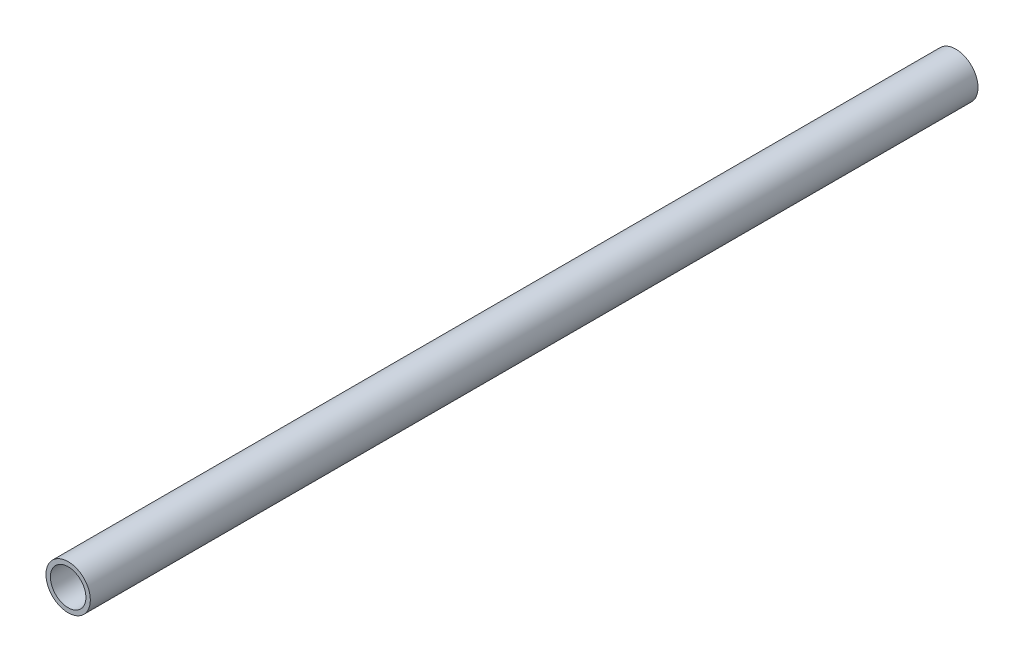
ISO-10303-21;
HEADER;
FILE_DESCRIPTION(('STEP AP214'),'2;1');
FILE_NAME('part.step','',(''),(''),'','','');
FILE_SCHEMA(('AUTOMOTIVE_DESIGN { 1 0 10303 214 1 1 1 1 }'));
ENDSEC;
DATA;
#1=APPLICATION_CONTEXT('core data for automotive mechanical design processes');
#2=APPLICATION_PROTOCOL_DEFINITION('international standard','automotive_design',2000,#1);
#3=PRODUCT_CONTEXT('',#1,'mechanical');
#4=PRODUCT('Part','Part','',(#3));
#5=PRODUCT_RELATED_PRODUCT_CATEGORY('part','',(#4));
#6=PRODUCT_DEFINITION_FORMATION('','',#4);
#7=PRODUCT_DEFINITION_CONTEXT('part definition',#1,'design');
#8=PRODUCT_DEFINITION('design','',#6,#7);
#9=PRODUCT_DEFINITION_SHAPE('','',#8);
#10=(LENGTH_UNIT() NAMED_UNIT(*) SI_UNIT(.MILLI.,.METRE.));
#11=(NAMED_UNIT(*) PLANE_ANGLE_UNIT() SI_UNIT($,.RADIAN.));
#12=(NAMED_UNIT(*) SI_UNIT($,.STERADIAN.) SOLID_ANGLE_UNIT());
#13=UNCERTAINTY_MEASURE_WITH_UNIT(LENGTH_MEASURE(1.E-05),#10,'distance_accuracy_value','');
#14=(GEOMETRIC_REPRESENTATION_CONTEXT(3) GLOBAL_UNCERTAINTY_ASSIGNED_CONTEXT((#13)) GLOBAL_UNIT_ASSIGNED_CONTEXT((#10,
#11,#12)) REPRESENTATION_CONTEXT('',''));
#15=CARTESIAN_POINT('',(0.,0.,0.));
#16=DIRECTION('',(0.,0.,1.));
#17=DIRECTION('',(1.,0.,0.));
#18=AXIS2_PLACEMENT_3D('',#15,#16,#17);
#19=CARTESIAN_POINT('',(0.,0.,200.));
#20=DIRECTION('',(0.,0.,1.));
#21=DIRECTION('',(1.,0.,0.));
#22=AXIS2_PLACEMENT_3D('',#19,#20,#21);
#23=PLANE('',#22);
#24=CARTESIAN_POINT('',(0.,0.,200.));
#25=DIRECTION('',(0.,0.,1.));
#26=DIRECTION('',(1.,0.,0.));
#27=AXIS2_PLACEMENT_3D('',#24,#25,#26);
#28=CIRCLE('',#27,5.);
#29=CARTESIAN_POINT('',(5.,0.,200.));
#30=VERTEX_POINT('',#29);
#31=EDGE_CURVE('E10',#30,#30,#28,.T.);
#32=ORIENTED_EDGE('',*,*,#31,.T.);
#33=EDGE_LOOP('',(#32));
#34=FACE_BOUND('',#33,.T.);
#35=CARTESIAN_POINT('',(0.,0.,200.));
#36=DIRECTION('',(0.,0.,1.));
#37=DIRECTION('',(1.,0.,0.));
#38=AXIS2_PLACEMENT_3D('',#35,#36,#37);
#39=CIRCLE('',#38,4.);
#40=CARTESIAN_POINT('',(4.,0.,200.));
#41=VERTEX_POINT('',#40);
#42=EDGE_CURVE('E47',#41,#41,#39,.T.);
#43=ORIENTED_EDGE('',*,*,#42,.F.);
#44=EDGE_LOOP('',(#43));
#45=FACE_BOUND('',#44,.T.);
#46=ADVANCED_FACE('F36',(#34,#45),#23,.T.);
#47=CARTESIAN_POINT('',(0.,0.,0.));
#48=DIRECTION('',(0.,0.,1.));
#49=DIRECTION('',(1.,0.,0.));
#50=AXIS2_PLACEMENT_3D('',#47,#48,#49);
#51=PLANE('',#50);
#52=CARTESIAN_POINT('',(0.,0.,0.));
#53=DIRECTION('',(0.,0.,1.));
#54=DIRECTION('',(1.,0.,0.));
#55=AXIS2_PLACEMENT_3D('',#52,#53,#54);
#56=CIRCLE('',#55,5.);
#57=CARTESIAN_POINT('',(5.,0.,0.));
#58=VERTEX_POINT('',#57);
#59=EDGE_CURVE('E40',#58,#58,#56,.T.);
#60=ORIENTED_EDGE('',*,*,#59,.F.);
#61=EDGE_LOOP('',(#60));
#62=FACE_BOUND('',#61,.T.);
#63=CARTESIAN_POINT('',(0.,0.,0.));
#64=DIRECTION('',(0.,0.,1.));
#65=DIRECTION('',(1.,0.,0.));
#66=AXIS2_PLACEMENT_3D('',#63,#64,#65);
#67=CIRCLE('',#66,4.);
#68=CARTESIAN_POINT('',(4.,0.,0.));
#69=VERTEX_POINT('',#68);
#70=EDGE_CURVE('E49',#69,#69,#67,.T.);
#71=ORIENTED_EDGE('',*,*,#70,.T.);
#72=EDGE_LOOP('',(#71));
#73=FACE_BOUND('',#72,.T.);
#74=ADVANCED_FACE('F59',(#62,#73),#51,.F.);
#75=CARTESIAN_POINT('',(0.,0.,200.));
#76=DIRECTION('',(0.,0.,-1.));
#77=DIRECTION('',(-1.,0.,0.));
#78=AXIS2_PLACEMENT_3D('',#75,#76,#77);
#79=CYLINDRICAL_SURFACE('',#78,5.);
#80=ORIENTED_EDGE('',*,*,#31,.F.);
#81=EDGE_LOOP('',(#80));
#82=FACE_BOUND('',#81,.T.);
#83=ORIENTED_EDGE('',*,*,#59,.T.);
#84=EDGE_LOOP('',(#83));
#85=FACE_BOUND('',#84,.T.);
#86=ADVANCED_FACE('F38',(#82,#85),#79,.T.);
#87=CARTESIAN_POINT('',(0.,0.,200.));
#88=DIRECTION('',(0.,0.,-1.));
#89=DIRECTION('',(-1.,0.,0.));
#90=AXIS2_PLACEMENT_3D('',#87,#88,#89);
#91=CYLINDRICAL_SURFACE('',#90,4.);
#92=ORIENTED_EDGE('',*,*,#42,.T.);
#93=EDGE_LOOP('',(#92));
#94=FACE_BOUND('',#93,.T.);
#95=ORIENTED_EDGE('',*,*,#70,.F.);
#96=EDGE_LOOP('',(#95));
#97=FACE_BOUND('',#96,.T.);
#98=ADVANCED_FACE('F55',(#94,#97),#91,.F.);
#99=CLOSED_SHELL('',(#46,#74,#86,#98));
#100=MANIFOLD_SOLID_BREP('B2',#99);
#101=ADVANCED_BREP_SHAPE_REPRESENTATION('',(#18,#100),#14);
#102=SHAPE_DEFINITION_REPRESENTATION(#9,#101);
ENDSEC;
END-ISO-10303-21;
